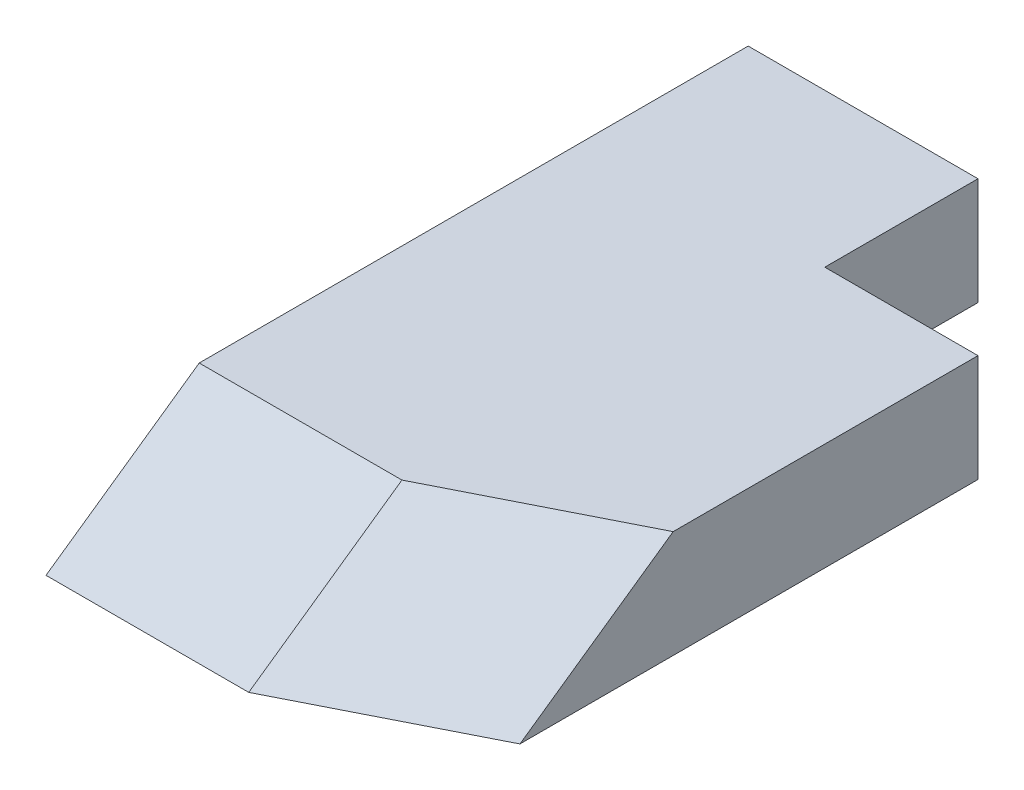
ISO-10303-21;
HEADER;
FILE_DESCRIPTION(('STEP AP214'),'2;1');
FILE_NAME('part.step','',(''),(''),'','','');
FILE_SCHEMA(('AUTOMOTIVE_DESIGN { 1 0 10303 214 1 1 1 1 }'));
ENDSEC;
DATA;
#1=APPLICATION_CONTEXT('core data for automotive mechanical design processes');
#2=APPLICATION_PROTOCOL_DEFINITION('international standard','automotive_design',2000,#1);
#3=PRODUCT_CONTEXT('',#1,'mechanical');
#4=PRODUCT('Part','Part','',(#3));
#5=PRODUCT_RELATED_PRODUCT_CATEGORY('part','',(#4));
#6=PRODUCT_DEFINITION_FORMATION('','',#4);
#7=PRODUCT_DEFINITION_CONTEXT('part definition',#1,'design');
#8=PRODUCT_DEFINITION('design','',#6,#7);
#9=PRODUCT_DEFINITION_SHAPE('','',#8);
#10=(LENGTH_UNIT() NAMED_UNIT(*) SI_UNIT(.MILLI.,.METRE.));
#11=(NAMED_UNIT(*) PLANE_ANGLE_UNIT() SI_UNIT($,.RADIAN.));
#12=(NAMED_UNIT(*) SI_UNIT($,.STERADIAN.) SOLID_ANGLE_UNIT());
#13=UNCERTAINTY_MEASURE_WITH_UNIT(LENGTH_MEASURE(1.E-05),#10,'distance_accuracy_value','');
#14=(GEOMETRIC_REPRESENTATION_CONTEXT(3) GLOBAL_UNCERTAINTY_ASSIGNED_CONTEXT((#13)) GLOBAL_UNIT_ASSIGNED_CONTEXT((#10,
#11,#12)) REPRESENTATION_CONTEXT('',''));
#15=CARTESIAN_POINT('',(0.,0.,0.));
#16=DIRECTION('',(0.,0.,1.));
#17=DIRECTION('',(1.,0.,0.));
#18=AXIS2_PLACEMENT_3D('',#15,#16,#17);
#19=CARTESIAN_POINT('',(15.,-7.,-15.));
#20=DIRECTION('',(0.,0.,1.));
#21=DIRECTION('',(0.,-1.,0.));
#22=AXIS2_PLACEMENT_3D('',#19,#20,#21);
#23=PLANE('',#22);
#24=DIRECTION('',(-1.,0.,0.));
#25=VECTOR('',#24,1.);
#26=CARTESIAN_POINT('',(15.,-7.,-15.));
#27=LINE('',#26,#25);
#28=CARTESIAN_POINT('',(3.,-7.,-15.));
#29=VERTEX_POINT('',#28);
#30=CARTESIAN_POINT('',(-15.,-7.,-15.));
#31=VERTEX_POINT('',#30);
#32=EDGE_CURVE('E128',#29,#31,#27,.T.);
#33=ORIENTED_EDGE('',*,*,#32,.F.);
#34=DIRECTION('',(0.,-1.,0.));
#35=VECTOR('',#34,1.);
#36=CARTESIAN_POINT('',(3.,-5.40249045851642,-15.));
#37=LINE('',#36,#35);
#38=CARTESIAN_POINT('',(3.,-15.4024904585164,-15.));
#39=VERTEX_POINT('',#38);
#40=EDGE_CURVE('E143',#29,#39,#37,.T.);
#41=ORIENTED_EDGE('',*,*,#40,.T.);
#42=DIRECTION('',(-1.,0.,0.));
#43=VECTOR('',#42,1.);
#44=CARTESIAN_POINT('',(15.,-15.4024904585164,-15.));
#45=LINE('',#44,#43);
#46=CARTESIAN_POINT('',(-15.,-15.4024904585164,-15.));
#47=VERTEX_POINT('',#46);
#48=EDGE_CURVE('E104',#39,#47,#45,.T.);
#49=ORIENTED_EDGE('',*,*,#48,.T.);
#50=DIRECTION('',(0.,1.,0.));
#51=VECTOR('',#50,1.);
#52=CARTESIAN_POINT('',(-15.,-7.,-15.));
#53=LINE('',#52,#51);
#54=EDGE_CURVE('E113',#47,#31,#53,.T.);
#55=ORIENTED_EDGE('',*,*,#54,.T.);
#56=EDGE_LOOP('',(#33,#41,#49,#55));
#57=FACE_BOUND('',#56,.T.);
#58=ADVANCED_FACE('F32',(#57),#23,.F.);
#59=CARTESIAN_POINT('',(15.,-7.,28.));
#60=DIRECTION('',(0.,-1.,0.));
#61=DIRECTION('',(0.,0.,-1.));
#62=AXIS2_PLACEMENT_3D('',#59,#60,#61);
#63=PLANE('',#62);
#64=DIRECTION('',(-1.,0.,0.));
#65=VECTOR('',#64,1.);
#66=CARTESIAN_POINT('',(15.,-7.,-3.));
#67=LINE('',#66,#65);
#68=CARTESIAN_POINT('',(15.,-7.,-3.));
#69=VERTEX_POINT('',#68);
#70=CARTESIAN_POINT('',(3.,-7.,-3.));
#71=VERTEX_POINT('',#70);
#72=EDGE_CURVE('E45',#69,#71,#67,.T.);
#73=ORIENTED_EDGE('',*,*,#72,.T.);
#74=DIRECTION('',(0.,0.,-1.));
#75=VECTOR('',#74,1.);
#76=CARTESIAN_POINT('',(3.,-7.,28.));
#77=LINE('',#76,#75);
#78=EDGE_CURVE('E139',#71,#29,#77,.T.);
#79=ORIENTED_EDGE('',*,*,#78,.T.);
#80=ORIENTED_EDGE('',*,*,#32,.T.);
#81=DIRECTION('',(0.,0.,1.));
#82=VECTOR('',#81,1.);
#83=CARTESIAN_POINT('',(-15.,-7.,28.));
#84=LINE('',#83,#82);
#85=CARTESIAN_POINT('',(-15.,-7.,28.));
#86=VERTEX_POINT('',#85);
#87=EDGE_CURVE('E116',#31,#86,#84,.T.);
#88=ORIENTED_EDGE('',*,*,#87,.T.);
#89=DIRECTION('',(-1.,0.,0.));
#90=VECTOR('',#89,1.);
#91=CARTESIAN_POINT('',(15.,-7.,28.));
#92=LINE('',#91,#90);
#93=CARTESIAN_POINT('',(0.880000000000004,-7.,28.));
#94=VERTEX_POINT('',#93);
#95=EDGE_CURVE('E126',#94,#86,#92,.T.);
#96=ORIENTED_EDGE('',*,*,#95,.F.);
#97=DIRECTION('',(0.892821775015855,0.,-0.450410122063811));
#98=VECTOR('',#97,1.);
#99=CARTESIAN_POINT('',(12.1354857938276,-7.,22.3218401789144));
#100=LINE('',#99,#98);
#101=CARTESIAN_POINT('',(15.,-7.,20.8767519996608));
#102=VERTEX_POINT('',#101);
#103=EDGE_CURVE('E117',#94,#102,#100,.T.);
#104=ORIENTED_EDGE('',*,*,#103,.T.);
#105=DIRECTION('',(0.,0.,1.));
#106=VECTOR('',#105,1.);
#107=CARTESIAN_POINT('',(15.,-7.,28.));
#108=LINE('',#107,#106);
#109=EDGE_CURVE('E105',#69,#102,#108,.T.);
#110=ORIENTED_EDGE('',*,*,#109,.F.);
#111=EDGE_LOOP('',(#73,#79,#80,#88,#96,#104,#110));
#112=FACE_BOUND('',#111,.T.);
#113=ADVANCED_FACE('F134',(#112),#63,.F.);
#114=CARTESIAN_POINT('',(15.,-7.,28.));
#115=DIRECTION('',(0.,-0.819152044288995,-0.573576436351041));
#116=DIRECTION('',(0.,0.573576436351042,-0.819152044288995));
#117=AXIS2_PLACEMENT_3D('',#114,#115,#116);
#118=PLANE('',#117);
#119=DIRECTION('',(-1.,0.,0.));
#120=VECTOR('',#119,1.);
#121=CARTESIAN_POINT('',(15.,-15.4024904585164,40.));
#122=LINE('',#121,#120);
#123=CARTESIAN_POINT('',(0.880000000000016,-15.4024904585164,40.));
#124=VERTEX_POINT('',#123);
#125=CARTESIAN_POINT('',(-15.,-15.4024904585164,40.));
#126=VERTEX_POINT('',#125);
#127=EDGE_CURVE('E107',#124,#126,#122,.T.);
#128=ORIENTED_EDGE('',*,*,#127,.F.);
#129=DIRECTION('',(0.,0.573576436351042,-0.819152044288995));
#130=VECTOR('',#129,1.);
#131=CARTESIAN_POINT('',(0.880000000000004,-7.00000000000001,28.));
#132=LINE('',#131,#130);
#133=EDGE_CURVE('E135',#124,#94,#132,.T.);
#134=ORIENTED_EDGE('',*,*,#133,.T.);
#135=ORIENTED_EDGE('',*,*,#95,.T.);
#136=DIRECTION('',(0.,-0.573576436351041,0.819152044288995));
#137=VECTOR('',#136,1.);
#138=CARTESIAN_POINT('',(-15.,-7.,28.));
#139=LINE('',#138,#137);
#140=EDGE_CURVE('E120',#86,#126,#139,.T.);
#141=ORIENTED_EDGE('',*,*,#140,.T.);
#142=EDGE_LOOP('',(#128,#134,#135,#141));
#143=FACE_BOUND('',#142,.T.);
#144=ADVANCED_FACE('F160',(#143),#118,.F.);
#145=CARTESIAN_POINT('',(15.,-15.4024904585164,40.));
#146=DIRECTION('',(0.,1.,0.));
#147=DIRECTION('',(0.,0.,1.));
#148=AXIS2_PLACEMENT_3D('',#145,#146,#147);
#149=PLANE('',#148);
#150=ORIENTED_EDGE('',*,*,#48,.F.);
#151=DIRECTION('',(0.,0.,-1.));
#152=VECTOR('',#151,1.);
#153=CARTESIAN_POINT('',(3.,-15.4024904585164,-15.));
#154=LINE('',#153,#152);
#155=CARTESIAN_POINT('',(3.,-15.4024904585164,-3.));
#156=VERTEX_POINT('',#155);
#157=EDGE_CURVE('E101',#156,#39,#154,.T.);
#158=ORIENTED_EDGE('',*,*,#157,.F.);
#159=DIRECTION('',(-1.,0.,0.));
#160=VECTOR('',#159,1.);
#161=CARTESIAN_POINT('',(15.,-15.4024904585164,-3.));
#162=LINE('',#161,#160);
#163=CARTESIAN_POINT('',(15.,-15.4024904585164,-3.));
#164=VERTEX_POINT('',#163);
#165=EDGE_CURVE('E91',#164,#156,#162,.T.);
#166=ORIENTED_EDGE('',*,*,#165,.F.);
#167=DIRECTION('',(0.,0.,-1.));
#168=VECTOR('',#167,1.);
#169=CARTESIAN_POINT('',(15.,-15.4024904585164,40.));
#170=LINE('',#169,#168);
#171=CARTESIAN_POINT('',(15.,-15.4024904585164,32.8767519996608));
#172=VERTEX_POINT('',#171);
#173=EDGE_CURVE('E100',#172,#164,#170,.T.);
#174=ORIENTED_EDGE('',*,*,#173,.F.);
#175=DIRECTION('',(-0.892821775015855,0.,0.450410122063811));
#176=VECTOR('',#175,1.);
#177=CARTESIAN_POINT('',(12.1354857938276,-15.4024904585164,34.3218401789144));
#178=LINE('',#177,#176);
#179=EDGE_CURVE('E53',#172,#124,#178,.T.);
#180=ORIENTED_EDGE('',*,*,#179,.T.);
#181=ORIENTED_EDGE('',*,*,#127,.T.);
#182=DIRECTION('',(0.,0.,-1.));
#183=VECTOR('',#182,1.);
#184=CARTESIAN_POINT('',(-15.,-15.4024904585164,40.));
#185=LINE('',#184,#183);
#186=EDGE_CURVE('E109',#126,#47,#185,.T.);
#187=ORIENTED_EDGE('',*,*,#186,.T.);
#188=EDGE_LOOP('',(#150,#158,#166,#174,#180,#181,#187));
#189=FACE_BOUND('',#188,.T.);
#190=ADVANCED_FACE('F99',(#189),#149,.F.);
#191=CARTESIAN_POINT('',(15.,0.,0.));
#192=DIRECTION('',(1.,0.,0.));
#193=DIRECTION('',(0.,0.,-1.));
#194=AXIS2_PLACEMENT_3D('',#191,#192,#193);
#195=PLANE('',#194);
#196=DIRECTION('',(0.,-1.,0.));
#197=VECTOR('',#196,1.);
#198=CARTESIAN_POINT('',(15.,0.,-3.));
#199=LINE('',#198,#197);
#200=EDGE_CURVE('E11',#69,#164,#199,.T.);
#201=ORIENTED_EDGE('',*,*,#200,.F.);
#202=ORIENTED_EDGE('',*,*,#109,.T.);
#203=DIRECTION('',(0.,0.573576436351041,-0.819152044288995));
#204=VECTOR('',#203,1.);
#205=CARTESIAN_POINT('',(15.,5.11179439838942,3.5793169715304));
#206=LINE('',#205,#204);
#207=EDGE_CURVE('E39',#172,#102,#206,.T.);
#208=ORIENTED_EDGE('',*,*,#207,.F.);
#209=ORIENTED_EDGE('',*,*,#173,.T.);
#210=EDGE_LOOP('',(#201,#202,#208,#209));
#211=FACE_BOUND('',#210,.T.);
#212=ADVANCED_FACE('F103',(#211),#195,.T.);
#213=CARTESIAN_POINT('',(-15.,0.,0.));
#214=DIRECTION('',(1.,0.,0.));
#215=DIRECTION('',(0.,0.,-1.));
#216=AXIS2_PLACEMENT_3D('',#213,#214,#215);
#217=PLANE('',#216);
#218=ORIENTED_EDGE('',*,*,#54,.F.);
#219=ORIENTED_EDGE('',*,*,#186,.F.);
#220=ORIENTED_EDGE('',*,*,#140,.F.);
#221=ORIENTED_EDGE('',*,*,#87,.F.);
#222=EDGE_LOOP('',(#218,#219,#220,#221));
#223=FACE_BOUND('',#222,.T.);
#224=ADVANCED_FACE('F158',(#223),#217,.F.);
#225=CARTESIAN_POINT('',(8.37649479177443,-11.620690629365,30.8172035161322));
#226=DIRECTION('',(-0.277955054295062,-0.786872604901476,-0.550974129562718));
#227=DIRECTION('',(0.,0.573576436351041,-0.819152044288995));
#228=AXIS2_PLACEMENT_3D('',#225,#226,#227);
#229=PLANE('',#228);
#230=ORIENTED_EDGE('',*,*,#133,.F.);
#231=ORIENTED_EDGE('',*,*,#179,.F.);
#232=ORIENTED_EDGE('',*,*,#207,.T.);
#233=ORIENTED_EDGE('',*,*,#103,.F.);
#234=EDGE_LOOP('',(#230,#231,#232,#233));
#235=FACE_BOUND('',#234,.T.);
#236=ADVANCED_FACE('F130',(#235),#229,.F.);
#237=CARTESIAN_POINT('',(3.,-5.40249045851642,-15.));
#238=DIRECTION('',(-1.,0.,0.));
#239=DIRECTION('',(0.,0.,1.));
#240=AXIS2_PLACEMENT_3D('',#237,#238,#239);
#241=PLANE('',#240);
#242=DIRECTION('',(0.,-1.,0.));
#243=VECTOR('',#242,1.);
#244=CARTESIAN_POINT('',(3.,-5.40249045851642,-3.));
#245=LINE('',#244,#243);
#246=EDGE_CURVE('E144',#71,#156,#245,.T.);
#247=ORIENTED_EDGE('',*,*,#246,.T.);
#248=ORIENTED_EDGE('',*,*,#157,.T.);
#249=ORIENTED_EDGE('',*,*,#40,.F.);
#250=ORIENTED_EDGE('',*,*,#78,.F.);
#251=EDGE_LOOP('',(#247,#248,#249,#250));
#252=FACE_BOUND('',#251,.T.);
#253=ADVANCED_FACE('F149',(#252),#241,.F.);
#254=CARTESIAN_POINT('',(15.,-5.40249045851642,-3.));
#255=DIRECTION('',(0.,0.,1.));
#256=DIRECTION('',(1.,0.,0.));
#257=AXIS2_PLACEMENT_3D('',#254,#255,#256);
#258=PLANE('',#257);
#259=ORIENTED_EDGE('',*,*,#200,.T.);
#260=ORIENTED_EDGE('',*,*,#165,.T.);
#261=ORIENTED_EDGE('',*,*,#246,.F.);
#262=ORIENTED_EDGE('',*,*,#72,.F.);
#263=EDGE_LOOP('',(#259,#260,#261,#262));
#264=FACE_BOUND('',#263,.T.);
#265=ADVANCED_FACE('F90',(#264),#258,.F.);
#266=CLOSED_SHELL('',(#58,#113,#144,#190,#212,#224,#236,#253,#265));
#267=MANIFOLD_SOLID_BREP('B2',#266);
#268=ADVANCED_BREP_SHAPE_REPRESENTATION('',(#18,#267),#14);
#269=SHAPE_DEFINITION_REPRESENTATION(#9,#268);
ENDSEC;
END-ISO-10303-21;
